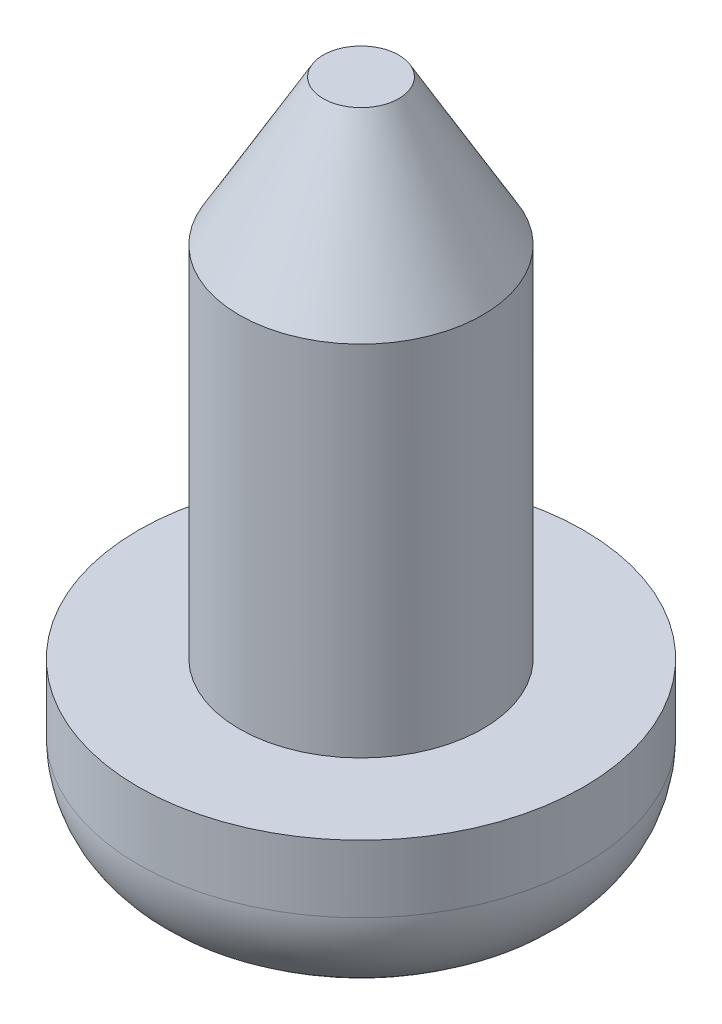
ISO-10303-21;
HEADER;
FILE_DESCRIPTION(('STEP AP214'),'2;1');
FILE_NAME('part.step','',(''),(''),'','','');
FILE_SCHEMA(('AUTOMOTIVE_DESIGN { 1 0 10303 214 1 1 1 1 }'));
ENDSEC;
DATA;
#1=APPLICATION_CONTEXT('core data for automotive mechanical design processes');
#2=APPLICATION_PROTOCOL_DEFINITION('international standard','automotive_design',2000,#1);
#3=PRODUCT_CONTEXT('',#1,'mechanical');
#4=PRODUCT('Part','Part','',(#3));
#5=PRODUCT_RELATED_PRODUCT_CATEGORY('part','',(#4));
#6=PRODUCT_DEFINITION_FORMATION('','',#4);
#7=PRODUCT_DEFINITION_CONTEXT('part definition',#1,'design');
#8=PRODUCT_DEFINITION('design','',#6,#7);
#9=PRODUCT_DEFINITION_SHAPE('','',#8);
#10=(LENGTH_UNIT() NAMED_UNIT(*) SI_UNIT(.MILLI.,.METRE.));
#11=(NAMED_UNIT(*) PLANE_ANGLE_UNIT() SI_UNIT($,.RADIAN.));
#12=(NAMED_UNIT(*) SI_UNIT($,.STERADIAN.) SOLID_ANGLE_UNIT());
#13=UNCERTAINTY_MEASURE_WITH_UNIT(LENGTH_MEASURE(1.E-05),#10,'distance_accuracy_value','');
#14=(GEOMETRIC_REPRESENTATION_CONTEXT(3) GLOBAL_UNCERTAINTY_ASSIGNED_CONTEXT((#13)) GLOBAL_UNIT_ASSIGNED_CONTEXT((#10,
#11,#12)) REPRESENTATION_CONTEXT('',''));
#15=CARTESIAN_POINT('',(0.,0.,0.));
#16=DIRECTION('',(0.,0.,1.));
#17=DIRECTION('',(1.,0.,0.));
#18=AXIS2_PLACEMENT_3D('',#15,#16,#17);
#19=CARTESIAN_POINT('',(-25.6015195369028,-127.705426917511,4.8000000000009));
#20=DIRECTION('',(-0.707106781186548,0.,0.707106781186548));
#21=DIRECTION('',(0.707106781186548,0.,0.707106781186548));
#22=AXIS2_PLACEMENT_3D('',#19,#20,#21);
#23=PLANE('',#22);
#24=DIRECTION('',(0.,-1.,0.));
#25=VECTOR('',#24,1.);
#26=CARTESIAN_POINT('',(-26.0015195369029,-127.705426917511,4.40000000000083));
#27=LINE('',#26,#25);
#28=CARTESIAN_POINT('',(-26.0015195369028,-128.705426917511,4.40000000000081));
#29=VERTEX_POINT('',#28);
#30=CARTESIAN_POINT('',(-26.001519536903,-127.705426917511,4.40000000000071));
#31=VERTEX_POINT('',#30);
#32=EDGE_CURVE('E557',#29,#31,#27,.F.);
#33=ORIENTED_EDGE('',*,*,#32,.T.);
#34=DIRECTION('',(0.707106781186486,0.,0.707106781186609));
#35=VECTOR('',#34,1.);
#36=CARTESIAN_POINT('',(-26.0015195369028,-127.705426917511,4.40000000000083));
#37=LINE('',#36,#35);
#38=CARTESIAN_POINT('',(-25.6015195369027,-127.705426917511,4.8000000000009));
#39=VERTEX_POINT('',#38);
#40=EDGE_CURVE('E555',#31,#39,#37,.T.);
#41=ORIENTED_EDGE('',*,*,#40,.T.);
#42=DIRECTION('',(0.,1.,0.));
#43=VECTOR('',#42,1.);
#44=CARTESIAN_POINT('',(-25.6015195369026,-127.705426917511,4.8000000000009));
#45=LINE('',#44,#43);
#46=CARTESIAN_POINT('',(-25.6015195369026,-128.705426917511,4.80000000000093));
#47=VERTEX_POINT('',#46);
#48=EDGE_CURVE('E540',#39,#47,#45,.F.);
#49=ORIENTED_EDGE('',*,*,#48,.T.);
#50=DIRECTION('',(0.707106781186478,0.,0.707106781186617));
#51=VECTOR('',#50,1.);
#52=CARTESIAN_POINT('',(-26.0015195369029,-128.705426917511,4.40000000000072));
#53=LINE('',#52,#51);
#54=EDGE_CURVE('E547',#29,#47,#53,.T.);
#55=ORIENTED_EDGE('',*,*,#54,.F.);
#56=EDGE_LOOP('',(#33,#41,#49,#55));
#57=FACE_BOUND('',#56,.T.);
#58=ADVANCED_FACE('F17',(#57),#23,.F.);
#59=CARTESIAN_POINT('',(-24.8015195369028,-127.705426917511,4.8000000000009));
#60=DIRECTION('',(0.707106781186548,0.,0.707106781186547));
#61=DIRECTION('',(0.707106781186547,0.,-0.707106781186548));
#62=AXIS2_PLACEMENT_3D('',#59,#60,#61);
#63=PLANE('',#62);
#64=DIRECTION('',(0.,1.,0.));
#65=VECTOR('',#64,1.);
#66=CARTESIAN_POINT('',(-24.8015195369029,-127.705426917511,4.80000000000062));
#67=LINE('',#66,#65);
#68=CARTESIAN_POINT('',(-24.8015195369029,-128.705426917511,4.80000000000055));
#69=VERTEX_POINT('',#68);
#70=CARTESIAN_POINT('',(-24.8015195369029,-127.705426917511,4.80000000000075));
#71=VERTEX_POINT('',#70);
#72=EDGE_CURVE('E140',#69,#71,#67,.T.);
#73=ORIENTED_EDGE('',*,*,#72,.T.);
#74=DIRECTION('',(0.707106781186509,0.,-0.707106781186586));
#75=VECTOR('',#74,1.);
#76=CARTESIAN_POINT('',(-24.8015195369028,-127.705426917511,4.8000000000009));
#77=LINE('',#76,#75);
#78=CARTESIAN_POINT('',(-24.4015195369028,-127.705426917511,4.40000000000086));
#79=VERTEX_POINT('',#78);
#80=EDGE_CURVE('E133',#71,#79,#77,.T.);
#81=ORIENTED_EDGE('',*,*,#80,.T.);
#82=DIRECTION('',(0.,-1.,0.));
#83=VECTOR('',#82,1.);
#84=CARTESIAN_POINT('',(-24.4015195369028,-127.705426917511,4.40000000000086));
#85=LINE('',#84,#83);
#86=CARTESIAN_POINT('',(-24.4015195369028,-128.705426917511,4.40000000000082));
#87=VERTEX_POINT('',#86);
#88=EDGE_CURVE('E476',#79,#87,#85,.T.);
#89=ORIENTED_EDGE('',*,*,#88,.T.);
#90=DIRECTION('',(0.707106781186726,0.,-0.707106781186369));
#91=VECTOR('',#90,1.);
#92=CARTESIAN_POINT('',(-24.801519536903,-128.705426917511,4.80000000000062));
#93=LINE('',#92,#91);
#94=EDGE_CURVE('E642',#69,#87,#93,.T.);
#95=ORIENTED_EDGE('',*,*,#94,.F.);
#96=EDGE_LOOP('',(#73,#81,#89,#95));
#97=FACE_BOUND('',#96,.T.);
#98=ADVANCED_FACE('F239',(#97),#63,.F.);
#99=CARTESIAN_POINT('',(-24.8015195369029,-127.705426917511,3.20000000000102));
#100=DIRECTION('',(0.707106781186548,0.,-0.707106781186548));
#101=DIRECTION('',(-0.707106781186548,0.,-0.707106781186548));
#102=AXIS2_PLACEMENT_3D('',#99,#100,#101);
#103=PLANE('',#102);
#104=DIRECTION('',(0.,1.,0.));
#105=VECTOR('',#104,1.);
#106=CARTESIAN_POINT('',(-24.4015195369028,-127.705426917511,3.60000000000083));
#107=LINE('',#106,#105);
#108=CARTESIAN_POINT('',(-24.4015195369028,-128.705426917511,3.60000000000085));
#109=VERTEX_POINT('',#108);
#110=CARTESIAN_POINT('',(-24.4015195369028,-127.705426917511,3.6000000000008));
#111=VERTEX_POINT('',#110);
#112=EDGE_CURVE('E628',#109,#111,#107,.T.);
#113=ORIENTED_EDGE('',*,*,#112,.T.);
#114=DIRECTION('',(-0.707106781186805,0.,-0.70710678118629));
#115=VECTOR('',#114,1.);
#116=CARTESIAN_POINT('',(-24.4015195369028,-127.705426917511,3.60000000000083));
#117=LINE('',#116,#115);
#118=CARTESIAN_POINT('',(-24.8015195369029,-127.705426917511,3.20000000000102));
#119=VERTEX_POINT('',#118);
#120=EDGE_CURVE('E598',#111,#119,#117,.T.);
#121=ORIENTED_EDGE('',*,*,#120,.T.);
#122=DIRECTION('',(0.,1.,0.));
#123=VECTOR('',#122,1.);
#124=CARTESIAN_POINT('',(-24.8015195369029,-127.705426917511,3.20000000000102));
#125=LINE('',#124,#123);
#126=CARTESIAN_POINT('',(-24.8015195369028,-128.705426917511,3.20000000000096));
#127=VERTEX_POINT('',#126);
#128=EDGE_CURVE('E392',#119,#127,#125,.F.);
#129=ORIENTED_EDGE('',*,*,#128,.T.);
#130=DIRECTION('',(-0.707106781186505,0.,-0.70710678118659));
#131=VECTOR('',#130,1.);
#132=CARTESIAN_POINT('',(-24.4015195369028,-128.705426917511,3.60000000000083));
#133=LINE('',#132,#131);
#134=EDGE_CURVE('E412',#109,#127,#133,.T.);
#135=ORIENTED_EDGE('',*,*,#134,.F.);
#136=EDGE_LOOP('',(#113,#121,#129,#135));
#137=FACE_BOUND('',#136,.T.);
#138=ADVANCED_FACE('F236',(#137),#103,.F.);
#139=CARTESIAN_POINT('',(-25.6015195369029,-127.705426917511,3.20000000000054));
#140=DIRECTION('',(-0.707106781186548,0.,-0.707106781186547));
#141=DIRECTION('',(-0.707106781186547,0.,0.707106781186548));
#142=AXIS2_PLACEMENT_3D('',#139,#140,#141);
#143=PLANE('',#142);
#144=DIRECTION('',(0.,1.,0.));
#145=VECTOR('',#144,1.);
#146=CARTESIAN_POINT('',(-25.601519536903,-127.705426917511,3.20000000000054));
#147=LINE('',#146,#145);
#148=CARTESIAN_POINT('',(-25.601519536903,-128.705426917511,3.20000000000061));
#149=VERTEX_POINT('',#148);
#150=CARTESIAN_POINT('',(-25.601519536903,-127.705426917511,3.20000000000057));
#151=VERTEX_POINT('',#150);
#152=EDGE_CURVE('E601',#149,#151,#147,.T.);
#153=ORIENTED_EDGE('',*,*,#152,.T.);
#154=DIRECTION('',(-0.707106781186344,0.,0.707106781186751));
#155=VECTOR('',#154,1.);
#156=CARTESIAN_POINT('',(-25.6015195369029,-127.705426917511,3.20000000000054));
#157=LINE('',#156,#155);
#158=CARTESIAN_POINT('',(-26.0015195369028,-127.705426917511,3.60000000000067));
#159=VERTEX_POINT('',#158);
#160=EDGE_CURVE('E558',#151,#159,#157,.T.);
#161=ORIENTED_EDGE('',*,*,#160,.T.);
#162=DIRECTION('',(0.,1.,0.));
#163=VECTOR('',#162,1.);
#164=CARTESIAN_POINT('',(-26.0015195369028,-127.705426917511,3.60000000000067));
#165=LINE('',#164,#163);
#166=CARTESIAN_POINT('',(-26.0015195369028,-128.705426917511,3.60000000000067));
#167=VERTEX_POINT('',#166);
#168=EDGE_CURVE('E593',#159,#167,#165,.F.);
#169=ORIENTED_EDGE('',*,*,#168,.T.);
#170=DIRECTION('',(-0.707106781186344,0.,0.707106781186751));
#171=VECTOR('',#170,1.);
#172=CARTESIAN_POINT('',(-25.6015195369029,-128.705426917511,3.20000000000054));
#173=LINE('',#172,#171);
#174=EDGE_CURVE('E329',#149,#167,#173,.T.);
#175=ORIENTED_EDGE('',*,*,#174,.F.);
#176=EDGE_LOOP('',(#153,#161,#169,#175));
#177=FACE_BOUND('',#176,.T.);
#178=ADVANCED_FACE('F233',(#177),#143,.F.);
#179=CARTESIAN_POINT('',(-25.6015195369028,-127.705426917511,4.40000000000083));
#180=DIRECTION('',(0.,1.,0.));
#181=DIRECTION('',(0.,0.,1.));
#182=AXIS2_PLACEMENT_3D('',#179,#180,#181);
#183=PLANE('',#182);
#184=ORIENTED_EDGE('',*,*,#40,.F.);
#185=DIRECTION('',(1.,0.,0.));
#186=VECTOR('',#185,1.);
#187=CARTESIAN_POINT('',(-26.0015195369028,-127.705426917511,4.40000000000083));
#188=LINE('',#187,#186);
#189=CARTESIAN_POINT('',(-26.701519536903,-127.705426917511,4.40000000000085));
#190=VERTEX_POINT('',#189);
#191=EDGE_CURVE('E562',#31,#190,#188,.F.);
#192=ORIENTED_EDGE('',*,*,#191,.T.);
#193=DIRECTION('',(0.,0.,1.));
#194=VECTOR('',#193,1.);
#195=CARTESIAN_POINT('',(-26.701519536903,-127.705426917511,4.40000000000047));
#196=LINE('',#195,#194);
#197=CARTESIAN_POINT('',(-26.701519536903,-127.705426917511,3.6000000000008));
#198=VERTEX_POINT('',#197);
#199=EDGE_CURVE('E173',#190,#198,#196,.F.);
#200=ORIENTED_EDGE('',*,*,#199,.T.);
#201=DIRECTION('',(-1.,0.,0.));
#202=VECTOR('',#201,1.);
#203=CARTESIAN_POINT('',(-26.0015195369028,-127.705426917511,3.60000000000067));
#204=LINE('',#203,#202);
#205=EDGE_CURVE('E216',#198,#159,#204,.F.);
#206=ORIENTED_EDGE('',*,*,#205,.T.);
#207=ORIENTED_EDGE('',*,*,#160,.F.);
#208=DIRECTION('',(0.,0.,1.));
#209=VECTOR('',#208,1.);
#210=CARTESIAN_POINT('',(-25.601519536903,-127.705426917511,2.50000000000068));
#211=LINE('',#210,#209);
#212=CARTESIAN_POINT('',(-25.601519536903,-127.705426917511,2.50000000000073));
#213=VERTEX_POINT('',#212);
#214=EDGE_CURVE('E603',#151,#213,#211,.F.);
#215=ORIENTED_EDGE('',*,*,#214,.T.);
#216=DIRECTION('',(-1.,0.,0.));
#217=VECTOR('',#216,1.);
#218=CARTESIAN_POINT('',(-24.8015195369029,-127.705426917511,2.50000000000082));
#219=LINE('',#218,#217);
#220=CARTESIAN_POINT('',(-24.8015195369029,-127.705426917511,2.50000000000082));
#221=VERTEX_POINT('',#220);
#222=EDGE_CURVE('E391',#213,#221,#219,.F.);
#223=ORIENTED_EDGE('',*,*,#222,.T.);
#224=DIRECTION('',(0.,0.,-1.));
#225=VECTOR('',#224,1.);
#226=CARTESIAN_POINT('',(-24.8015195369029,-127.705426917511,2.50000000000082));
#227=LINE('',#226,#225);
#228=EDGE_CURVE('E613',#221,#119,#227,.F.);
#229=ORIENTED_EDGE('',*,*,#228,.T.);
#230=ORIENTED_EDGE('',*,*,#120,.F.);
#231=DIRECTION('',(-1.,0.,0.));
#232=VECTOR('',#231,1.);
#233=CARTESIAN_POINT('',(-24.4015195369028,-127.705426917511,3.60000000000083));
#234=LINE('',#233,#232);
#235=CARTESIAN_POINT('',(-23.7015195369029,-127.705426917511,3.60000000000083));
#236=VERTEX_POINT('',#235);
#237=EDGE_CURVE('E630',#111,#236,#234,.F.);
#238=ORIENTED_EDGE('',*,*,#237,.T.);
#239=DIRECTION('',(0.,0.,1.));
#240=VECTOR('',#239,1.);
#241=CARTESIAN_POINT('',(-23.7015195369029,-127.705426917511,4.40000000000066));
#242=LINE('',#241,#240);
#243=CARTESIAN_POINT('',(-23.7015195369029,-127.705426917511,4.40000000000073));
#244=VERTEX_POINT('',#243);
#245=EDGE_CURVE('E475',#236,#244,#242,.T.);
#246=ORIENTED_EDGE('',*,*,#245,.T.);
#247=DIRECTION('',(1.,0.,0.));
#248=VECTOR('',#247,1.);
#249=CARTESIAN_POINT('',(-24.4015195369028,-127.705426917511,4.40000000000086));
#250=LINE('',#249,#248);
#251=EDGE_CURVE('E640',#244,#79,#250,.F.);
#252=ORIENTED_EDGE('',*,*,#251,.T.);
#253=ORIENTED_EDGE('',*,*,#80,.F.);
#254=DIRECTION('',(0.,0.,-1.));
#255=VECTOR('',#254,1.);
#256=CARTESIAN_POINT('',(-24.8015195369029,-127.705426917511,5.5000000000009));
#257=LINE('',#256,#255);
#258=CARTESIAN_POINT('',(-24.8015195369029,-127.705426917511,5.5000000000009));
#259=VERTEX_POINT('',#258);
#260=EDGE_CURVE('E516',#71,#259,#257,.F.);
#261=ORIENTED_EDGE('',*,*,#260,.T.);
#262=DIRECTION('',(1.,0.,0.));
#263=VECTOR('',#262,1.);
#264=CARTESIAN_POINT('',(-24.8015195369029,-127.705426917511,5.5000000000009));
#265=LINE('',#264,#263);
#266=CARTESIAN_POINT('',(-25.6015195369026,-127.705426917511,5.5000000000009));
#267=VERTEX_POINT('',#266);
#268=EDGE_CURVE('E520',#259,#267,#265,.F.);
#269=ORIENTED_EDGE('',*,*,#268,.T.);
#270=DIRECTION('',(0.,0.,1.));
#271=VECTOR('',#270,1.);
#272=CARTESIAN_POINT('',(-25.6015195369026,-127.705426917511,5.50000000000099));
#273=LINE('',#272,#271);
#274=EDGE_CURVE('E543',#267,#39,#273,.F.);
#275=ORIENTED_EDGE('',*,*,#274,.T.);
#276=EDGE_LOOP('',(#184,#192,#200,#206,#207,#215,#223,#229,#230,#238,#246,#252,#253,#261,#269,#275));
#277=FACE_BOUND('',#276,.T.);
#278=ADVANCED_FACE('F228',(#277),#183,.F.);
#279=CARTESIAN_POINT('',(-26.0015195369028,-127.705426917511,4.40000000000083));
#280=DIRECTION('',(0.,0.,1.));
#281=DIRECTION('',(0.,-1.,0.));
#282=AXIS2_PLACEMENT_3D('',#279,#280,#281);
#283=PLANE('',#282);
#284=DIRECTION('',(0.,1.,0.));
#285=VECTOR('',#284,1.);
#286=CARTESIAN_POINT('',(-26.701519536903,-127.705426917511,4.40000000000086));
#287=LINE('',#286,#285);
#288=CARTESIAN_POINT('',(-26.701519536903,-128.701048371783,4.40000000000085));
#289=VERTEX_POINT('',#288);
#290=EDGE_CURVE('E190',#289,#190,#287,.T.);
#291=ORIENTED_EDGE('',*,*,#290,.T.);
#292=ORIENTED_EDGE('',*,*,#191,.F.);
#293=ORIENTED_EDGE('',*,*,#32,.F.);
#294=DIRECTION('',(1.,0.,0.));
#295=VECTOR('',#294,1.);
#296=CARTESIAN_POINT('',(-25.2015195369029,-128.705426917511,4.4000000000008));
#297=LINE('',#296,#295);
#298=CARTESIAN_POINT('',(-26.5952555233796,-128.705426917511,4.40000000000081));
#299=VERTEX_POINT('',#298);
#300=EDGE_CURVE('E198',#299,#29,#297,.T.);
#301=ORIENTED_EDGE('',*,*,#300,.F.);
#302=CARTESIAN_POINT('',(-26.7015195369029,-128.701048371783,4.40000000000083));
#303=CARTESIAN_POINT('',(-26.6486181802466,-128.705426917511,4.40000000000083));
#304=CARTESIAN_POINT('',(-26.5952555233796,-128.705426917511,4.40000000000083));
#305=B_SPLINE_CURVE_WITH_KNOTS('',2,(#302,#303,#304),.UNSPECIFIED.,.F.,.F.,(3,3),(0.,1.),.UNSPECIFIED.);
#306=EDGE_CURVE('E183',#289,#299,#305,.T.);
#307=ORIENTED_EDGE('',*,*,#306,.F.);
#308=EDGE_LOOP('',(#291,#292,#293,#301,#307));
#309=FACE_BOUND('',#308,.T.);
#310=ADVANCED_FACE('F196',(#309),#283,.F.);
#311=CARTESIAN_POINT('',(-25.2015195369029,-128.705426917511,4.00000000000076));
#312=DIRECTION('',(0.,-1.,0.));
#313=DIRECTION('',(0.,0.,-1.));
#314=AXIS2_PLACEMENT_3D('',#311,#312,#313);
#315=PLANE('',#314);
#316=ORIENTED_EDGE('',*,*,#300,.T.);
#317=ORIENTED_EDGE('',*,*,#54,.T.);
#318=DIRECTION('',(0.,0.,1.));
#319=VECTOR('',#318,1.);
#320=CARTESIAN_POINT('',(-25.6015195369026,-128.705426917511,5.50000000000099));
#321=LINE('',#320,#319);
#322=CARTESIAN_POINT('',(-25.6015195369028,-128.705426917511,5.39373598647745));
#323=VERTEX_POINT('',#322);
#324=EDGE_CURVE('E80',#47,#323,#321,.T.);
#325=ORIENTED_EDGE('',*,*,#324,.T.);
#326=CARTESIAN_POINT('',(-25.2015195369029,-128.705426917511,4.00000000000076));
#327=DIRECTION('',(0.,1.,0.));
#328=DIRECTION('',(-0.961197232052848,0.,0.275862068965531));
#329=AXIS2_PLACEMENT_3D('',#326,#327,#328);
#330=CIRCLE('',#329,1.45000000000007);
#331=EDGE_CURVE('E199',#299,#323,#330,.T.);
#332=ORIENTED_EDGE('',*,*,#331,.F.);
#333=EDGE_LOOP('',(#316,#317,#325,#332));
#334=FACE_BOUND('',#333,.T.);
#335=ADVANCED_FACE('F227',(#334),#315,.T.);
#336=CARTESIAN_POINT('',(-25.6015195369026,-127.705426917511,5.50000000000099));
#337=DIRECTION('',(-1.,0.,0.));
#338=DIRECTION('',(0.,0.,1.));
#339=AXIS2_PLACEMENT_3D('',#336,#337,#338);
#340=PLANE('',#339);
#341=ORIENTED_EDGE('',*,*,#324,.F.);
#342=ORIENTED_EDGE('',*,*,#48,.F.);
#343=ORIENTED_EDGE('',*,*,#274,.F.);
#344=DIRECTION('',(0.,-1.,0.));
#345=VECTOR('',#344,1.);
#346=CARTESIAN_POINT('',(-25.6015195369026,-127.705426917511,5.5000000000009));
#347=LINE('',#346,#345);
#348=CARTESIAN_POINT('',(-25.6015195369026,-128.701048371783,5.5000000000009));
#349=VERTEX_POINT('',#348);
#350=EDGE_CURVE('E71',#267,#349,#347,.T.);
#351=ORIENTED_EDGE('',*,*,#350,.T.);
#352=CARTESIAN_POINT('',(-25.6015195369026,-128.705426917511,5.39373598647745));
#353=CARTESIAN_POINT('',(-25.6015195369026,-128.705426917511,5.4470986433398));
#354=CARTESIAN_POINT('',(-25.6015195369026,-128.701048371783,5.50000000000099));
#355=B_SPLINE_CURVE_WITH_KNOTS('',2,(#352,#353,#354),.UNSPECIFIED.,.F.,.F.,(3,3),(0.,1.),.UNSPECIFIED.);
#356=EDGE_CURVE('E201',#323,#349,#355,.T.);
#357=ORIENTED_EDGE('',*,*,#356,.F.);
#358=EDGE_LOOP('',(#341,#342,#343,#351,#357));
#359=FACE_BOUND('',#358,.T.);
#360=ADVANCED_FACE('F526',(#359),#340,.F.);
#361=CARTESIAN_POINT('',(-24.8015195369029,-127.705426917511,5.5000000000009));
#362=DIRECTION('',(0.,0.,1.));
#363=DIRECTION('',(0.,-1.,0.));
#364=AXIS2_PLACEMENT_3D('',#361,#362,#363);
#365=PLANE('',#364);
#366=ORIENTED_EDGE('',*,*,#350,.F.);
#367=ORIENTED_EDGE('',*,*,#268,.F.);
#368=DIRECTION('',(0.,1.,0.));
#369=VECTOR('',#368,1.);
#370=CARTESIAN_POINT('',(-24.8015195369029,-127.705426917511,5.5000000000009));
#371=LINE('',#370,#369);
#372=CARTESIAN_POINT('',(-24.8015195369029,-128.701048371783,5.50000000000096));
#373=VERTEX_POINT('',#372);
#374=EDGE_CURVE('E509',#259,#373,#371,.F.);
#375=ORIENTED_EDGE('',*,*,#374,.T.);
#376=CARTESIAN_POINT('',(-25.6015195369026,-128.701048371783,5.5000000000009));
#377=CARTESIAN_POINT('',(-25.5681902608363,-128.701780812457,5.5000000000009));
#378=CARTESIAN_POINT('',(-25.5348580466462,-128.702341137003,5.5000000000009));
#379=CARTESIAN_POINT('',(-25.4681911217274,-128.703212528076,5.5000000000009));
#380=CARTESIAN_POINT('',(-25.4348564110878,-128.70352360118,5.5000000000009));
#381=CARTESIAN_POINT('',(-25.3348551887602,-128.704225408128,5.5000000000009));
#382=CARTESIAN_POINT('',(-25.2681873628315,-128.704384798339,5.5000000000009));
#383=CARTESIAN_POINT('',(-25.134851710974,-128.704384798339,5.5000000000009));
#384=CARTESIAN_POINT('',(-25.0681838850453,-128.704225408128,5.5000000000009));
#385=CARTESIAN_POINT('',(-24.9681826627177,-128.70352360118,5.5000000000009));
#386=CARTESIAN_POINT('',(-24.9348479520781,-128.703212528076,5.5000000000009));
#387=CARTESIAN_POINT('',(-24.8681810271593,-128.702341137003,5.5000000000009));
#388=CARTESIAN_POINT('',(-24.8348488129691,-128.701780812457,5.5000000000009));
#389=CARTESIAN_POINT('',(-24.8015195369029,-128.701048371783,5.5000000000009));
#390=B_SPLINE_CURVE_WITH_KNOTS('',3,(#376,#377,#378,#379,#380,#381,#382,#383,#384,#385,#386,
#387,#388,#389),.UNSPECIFIED.,.F.,.F.,(4,2,2,2,2,2,4),(0.,0.100010330135586,0.20001802085428,
0.400020729846193,0.600023438838106,0.7000311295568,0.800041459692386),.UNSPECIFIED.);
#391=EDGE_CURVE('E675',#349,#373,#390,.T.);
#392=ORIENTED_EDGE('',*,*,#391,.F.);
#393=EDGE_LOOP('',(#366,#367,#375,#392));
#394=FACE_BOUND('',#393,.T.);
#395=ADVANCED_FACE('F503',(#394),#365,.F.);
#396=CARTESIAN_POINT('',(-24.8015195369029,-127.705426917511,5.5000000000009));
#397=DIRECTION('',(1.,0.,0.));
#398=DIRECTION('',(0.,0.,-1.));
#399=AXIS2_PLACEMENT_3D('',#396,#397,#398);
#400=PLANE('',#399);
#401=ORIENTED_EDGE('',*,*,#374,.F.);
#402=ORIENTED_EDGE('',*,*,#260,.F.);
#403=ORIENTED_EDGE('',*,*,#72,.F.);
#404=DIRECTION('',(0.,0.,-1.));
#405=VECTOR('',#404,1.);
#406=CARTESIAN_POINT('',(-24.8015195369029,-128.705426917511,4.00000000000076));
#407=LINE('',#406,#405);
#408=CARTESIAN_POINT('',(-24.8015195369029,-128.705426917511,5.39373598647723));
#409=VERTEX_POINT('',#408);
#410=EDGE_CURVE('E488',#409,#69,#407,.T.);
#411=ORIENTED_EDGE('',*,*,#410,.F.);
#412=CARTESIAN_POINT('',(-24.8015195369029,-128.701048371783,5.50000000000096));
#413=CARTESIAN_POINT('',(-24.8015195369029,-128.705426917511,5.44709864334455));
#414=CARTESIAN_POINT('',(-24.8015195369029,-128.705426917511,5.39373598647723));
#415=B_SPLINE_CURVE_WITH_KNOTS('',2,(#412,#413,#414),.UNSPECIFIED.,.F.,.F.,(3,3),(0.,1.),.UNSPECIFIED.);
#416=EDGE_CURVE('E460',#373,#409,#415,.T.);
#417=ORIENTED_EDGE('',*,*,#416,.F.);
#418=EDGE_LOOP('',(#401,#402,#403,#411,#417));
#419=FACE_BOUND('',#418,.T.);
#420=ADVANCED_FACE('F499',(#419),#400,.F.);
#421=CARTESIAN_POINT('',(-25.2015195369029,-128.705426917511,4.00000000000076));
#422=DIRECTION('',(0.,-1.,0.));
#423=DIRECTION('',(0.,0.,-1.));
#424=AXIS2_PLACEMENT_3D('',#421,#422,#423);
#425=PLANE('',#424);
#426=DIRECTION('',(1.,0.,0.));
#427=VECTOR('',#426,1.);
#428=CARTESIAN_POINT('',(-24.4015195369028,-128.705426917511,4.40000000000086));
#429=LINE('',#428,#427);
#430=CARTESIAN_POINT('',(-23.8077835504262,-128.705426917511,4.40000000000078));
#431=VERTEX_POINT('',#430);
#432=EDGE_CURVE('E468',#87,#431,#429,.T.);
#433=ORIENTED_EDGE('',*,*,#432,.T.);
#434=CARTESIAN_POINT('',(-25.2015195369029,-128.705426917511,4.00000000000076));
#435=DIRECTION('',(0.,1.,0.));
#436=DIRECTION('',(0.275862068965546,0.,0.961197232052844));
#437=AXIS2_PLACEMENT_3D('',#434,#435,#436);
#438=CIRCLE('',#437,1.44999999999984);
#439=EDGE_CURVE('E459',#409,#431,#438,.T.);
#440=ORIENTED_EDGE('',*,*,#439,.F.);
#441=ORIENTED_EDGE('',*,*,#410,.T.);
#442=ORIENTED_EDGE('',*,*,#94,.T.);
#443=EDGE_LOOP('',(#433,#440,#441,#442));
#444=FACE_BOUND('',#443,.T.);
#445=ADVANCED_FACE('F490',(#444),#425,.T.);
#446=CARTESIAN_POINT('',(-24.4015195369028,-127.705426917511,4.40000000000086));
#447=DIRECTION('',(0.,0.,1.));
#448=DIRECTION('',(0.,-1.,0.));
#449=AXIS2_PLACEMENT_3D('',#446,#447,#448);
#450=PLANE('',#449);
#451=ORIENTED_EDGE('',*,*,#432,.F.);
#452=ORIENTED_EDGE('',*,*,#88,.F.);
#453=ORIENTED_EDGE('',*,*,#251,.F.);
#454=DIRECTION('',(0.,1.,0.));
#455=VECTOR('',#454,1.);
#456=CARTESIAN_POINT('',(-23.7015195369029,-127.705426917511,4.40000000000066));
#457=LINE('',#456,#455);
#458=CARTESIAN_POINT('',(-23.7015195369029,-128.701048371783,4.40000000000068));
#459=VERTEX_POINT('',#458);
#460=EDGE_CURVE('E631',#244,#459,#457,.F.);
#461=ORIENTED_EDGE('',*,*,#460,.T.);
#462=CARTESIAN_POINT('',(-23.8077835504262,-128.705426917511,4.40000000000086));
#463=CARTESIAN_POINT('',(-23.7544208935639,-128.705426917511,4.40000000000086));
#464=CARTESIAN_POINT('',(-23.7015195369029,-128.701048371783,4.40000000000086));
#465=B_SPLINE_CURVE_WITH_KNOTS('',2,(#462,#463,#464),.UNSPECIFIED.,.F.,.F.,(3,3),(0.,1.),.UNSPECIFIED.);
#466=EDGE_CURVE('E455',#431,#459,#465,.T.);
#467=ORIENTED_EDGE('',*,*,#466,.F.);
#468=EDGE_LOOP('',(#451,#452,#453,#461,#467));
#469=FACE_BOUND('',#468,.T.);
#470=ADVANCED_FACE('F443',(#469),#450,.F.);
#471=CARTESIAN_POINT('',(-23.7015195369029,-127.705426917511,4.40000000000066));
#472=DIRECTION('',(1.,0.,0.));
#473=DIRECTION('',(0.,1.,0.));
#474=AXIS2_PLACEMENT_3D('',#471,#472,#473);
#475=PLANE('',#474);
#476=CARTESIAN_POINT('',(-23.7015195369029,-128.701048371783,4.4000000000007));
#477=CARTESIAN_POINT('',(-23.7015195369029,-128.701780812457,4.36667072393444));
#478=CARTESIAN_POINT('',(-23.7015195369029,-128.702341137003,4.33333850974428));
#479=CARTESIAN_POINT('',(-23.7015195369029,-128.703212528076,4.26667158482546));
#480=CARTESIAN_POINT('',(-23.7015195369029,-128.70352360118,4.2333368741859));
#481=CARTESIAN_POINT('',(-23.7015195369029,-128.704225408128,4.13333565185823));
#482=CARTESIAN_POINT('',(-23.7015195369029,-128.704384798339,4.0666678259295));
#483=CARTESIAN_POINT('',(-23.7015195369029,-128.704384798339,3.93333217407203));
#484=CARTESIAN_POINT('',(-23.7015195369029,-128.704225408128,3.86666434814329));
#485=CARTESIAN_POINT('',(-23.7015195369029,-128.70352360118,3.7666631258156));
#486=CARTESIAN_POINT('',(-23.7015195369029,-128.703212528076,3.73332841517604));
#487=CARTESIAN_POINT('',(-23.7015195369029,-128.702341137003,3.66666149025721));
#488=CARTESIAN_POINT('',(-23.7015195369029,-128.701780812457,3.63332927606705));
#489=CARTESIAN_POINT('',(-23.7015195369029,-128.701048371783,3.60000000000078));
#490=B_SPLINE_CURVE_WITH_KNOTS('',3,(#476,#477,#478,#479,#480,#481,#482,#483,#484,#485,#486,
#487,#488,#489),.UNSPECIFIED.,.F.,.F.,(4,2,2,2,2,2,4),(0.,0.100010330135607,0.200018020854321,
0.400020729846275,0.600023438838254,0.70003112955698,0.8000414596926),.UNSPECIFIED.);
#491=CARTESIAN_POINT('',(-23.7015195369029,-128.701048371783,3.60000000000083));
#492=VERTEX_POINT('',#491);
#493=EDGE_CURVE('E448',#459,#492,#490,.T.);
#494=ORIENTED_EDGE('',*,*,#493,.F.);
#495=ORIENTED_EDGE('',*,*,#460,.F.);
#496=ORIENTED_EDGE('',*,*,#245,.F.);
#497=DIRECTION('',(0.,1.,0.));
#498=VECTOR('',#497,1.);
#499=CARTESIAN_POINT('',(-23.7015195369029,-127.705426917511,3.60000000000083));
#500=LINE('',#499,#498);
#501=EDGE_CURVE('E413',#236,#492,#500,.F.);
#502=ORIENTED_EDGE('',*,*,#501,.T.);
#503=EDGE_LOOP('',(#494,#495,#496,#502));
#504=FACE_BOUND('',#503,.T.);
#505=ADVANCED_FACE('F438',(#504),#475,.F.);
#506=CARTESIAN_POINT('',(-24.4015195369028,-127.705426917511,3.60000000000083));
#507=DIRECTION('',(0.,0.,-1.));
#508=DIRECTION('',(-1.,0.,0.));
#509=AXIS2_PLACEMENT_3D('',#506,#507,#508);
#510=PLANE('',#509);
#511=ORIENTED_EDGE('',*,*,#501,.F.);
#512=ORIENTED_EDGE('',*,*,#237,.F.);
#513=ORIENTED_EDGE('',*,*,#112,.F.);
#514=DIRECTION('',(1.,0.,0.));
#515=VECTOR('',#514,1.);
#516=CARTESIAN_POINT('',(-25.2015195369029,-128.705426917511,3.60000000000086));
#517=LINE('',#516,#515);
#518=CARTESIAN_POINT('',(-23.8077835504261,-128.705426917511,3.60000000000085));
#519=VERTEX_POINT('',#518);
#520=EDGE_CURVE('E405',#519,#109,#517,.F.);
#521=ORIENTED_EDGE('',*,*,#520,.F.);
#522=CARTESIAN_POINT('',(-23.7015195369029,-128.701048371783,3.60000000000083));
#523=CARTESIAN_POINT('',(-23.7544208935592,-128.705426917511,3.60000000000083));
#524=CARTESIAN_POINT('',(-23.8077835504261,-128.705426917511,3.60000000000083));
#525=B_SPLINE_CURVE_WITH_KNOTS('',2,(#522,#523,#524),.UNSPECIFIED.,.F.,.F.,(3,3),(0.,1.),.UNSPECIFIED.);
#526=EDGE_CURVE('E454',#492,#519,#525,.T.);
#527=ORIENTED_EDGE('',*,*,#526,.F.);
#528=EDGE_LOOP('',(#511,#512,#513,#521,#527));
#529=FACE_BOUND('',#528,.T.);
#530=ADVANCED_FACE('F429',(#529),#510,.F.);
#531=CARTESIAN_POINT('',(-25.2015195369029,-128.705426917511,4.00000000000076));
#532=DIRECTION('',(0.,-1.,0.));
#533=DIRECTION('',(0.,0.,-1.));
#534=AXIS2_PLACEMENT_3D('',#531,#532,#533);
#535=PLANE('',#534);
#536=DIRECTION('',(0.,0.,-1.));
#537=VECTOR('',#536,1.);
#538=CARTESIAN_POINT('',(-24.8015195369029,-128.705426917511,2.50000000000082));
#539=LINE('',#538,#537);
#540=CARTESIAN_POINT('',(-24.8015195369028,-128.705426917511,2.60626401352427));
#541=VERTEX_POINT('',#540);
#542=EDGE_CURVE('E384',#127,#541,#539,.T.);
#543=ORIENTED_EDGE('',*,*,#542,.T.);
#544=CARTESIAN_POINT('',(-25.2015195369029,-128.705426917511,4.00000000000076));
#545=DIRECTION('',(0.,1.,0.));
#546=DIRECTION('',(0.961197232052878,0.,-0.275862068965426));
#547=AXIS2_PLACEMENT_3D('',#544,#545,#546);
#548=CIRCLE('',#547,1.45000000000013);
#549=EDGE_CURVE('E400',#519,#541,#548,.T.);
#550=ORIENTED_EDGE('',*,*,#549,.F.);
#551=ORIENTED_EDGE('',*,*,#520,.T.);
#552=ORIENTED_EDGE('',*,*,#134,.T.);
#553=EDGE_LOOP('',(#543,#550,#551,#552));
#554=FACE_BOUND('',#553,.T.);
#555=ADVANCED_FACE('F374',(#554),#535,.T.);
#556=CARTESIAN_POINT('',(-24.8015195369029,-127.705426917511,2.50000000000082));
#557=DIRECTION('',(1.,0.,0.));
#558=DIRECTION('',(0.,0.,-1.));
#559=AXIS2_PLACEMENT_3D('',#556,#557,#558);
#560=PLANE('',#559);
#561=ORIENTED_EDGE('',*,*,#542,.F.);
#562=ORIENTED_EDGE('',*,*,#128,.F.);
#563=ORIENTED_EDGE('',*,*,#228,.F.);
#564=DIRECTION('',(0.,1.,0.));
#565=VECTOR('',#564,1.);
#566=CARTESIAN_POINT('',(-24.8015195369029,-127.705426917511,2.50000000000082));
#567=LINE('',#566,#565);
#568=CARTESIAN_POINT('',(-24.8015195369028,-128.701048371783,2.50000000000082));
#569=VERTEX_POINT('',#568);
#570=EDGE_CURVE('E604',#221,#569,#567,.F.);
#571=ORIENTED_EDGE('',*,*,#570,.T.);
#572=CARTESIAN_POINT('',(-24.8015195369029,-128.705426917511,2.60626401352433));
#573=CARTESIAN_POINT('',(-24.8015195369029,-128.705426917511,2.55290135666192));
#574=CARTESIAN_POINT('',(-24.8015195369029,-128.701048371783,2.50000000000076));
#575=B_SPLINE_CURVE_WITH_KNOTS('',2,(#572,#573,#574),.UNSPECIFIED.,.F.,.F.,(3,3),(0.,1.),.UNSPECIFIED.);
#576=EDGE_CURVE('E362',#541,#569,#575,.T.);
#577=ORIENTED_EDGE('',*,*,#576,.F.);
#578=EDGE_LOOP('',(#561,#562,#563,#571,#577));
#579=FACE_BOUND('',#578,.T.);
#580=ADVANCED_FACE('F369',(#579),#560,.F.);
#581=CARTESIAN_POINT('',(-24.8015195369029,-127.705426917511,2.50000000000082));
#582=DIRECTION('',(0.,0.,-1.));
#583=DIRECTION('',(-1.,0.,0.));
#584=AXIS2_PLACEMENT_3D('',#581,#582,#583);
#585=PLANE('',#584);
#586=ORIENTED_EDGE('',*,*,#570,.F.);
#587=ORIENTED_EDGE('',*,*,#222,.F.);
#588=DIRECTION('',(0.,1.,0.));
#589=VECTOR('',#588,1.);
#590=CARTESIAN_POINT('',(-25.601519536903,-127.705426917511,2.50000000000068));
#591=LINE('',#590,#589);
#592=CARTESIAN_POINT('',(-25.601519536903,-128.701048371783,2.50000000000068));
#593=VERTEX_POINT('',#592);
#594=EDGE_CURVE('E330',#213,#593,#591,.F.);
#595=ORIENTED_EDGE('',*,*,#594,.T.);
#596=CARTESIAN_POINT('',(-24.8015195369028,-128.701048371783,2.50000000000082));
#597=CARTESIAN_POINT('',(-24.8348488129691,-128.701780812457,2.50000000000082));
#598=CARTESIAN_POINT('',(-24.8681810271593,-128.702341137003,2.50000000000082));
#599=CARTESIAN_POINT('',(-24.9348479520781,-128.703212528076,2.50000000000082));
#600=CARTESIAN_POINT('',(-24.9681826627177,-128.70352360118,2.50000000000082));
#601=CARTESIAN_POINT('',(-25.0681838850454,-128.704225408128,2.50000000000082));
#602=CARTESIAN_POINT('',(-25.1348517109742,-128.704384798339,2.50000000000082));
#603=CARTESIAN_POINT('',(-25.2681873628317,-128.704384798339,2.50000000000082));
#604=CARTESIAN_POINT('',(-25.3348551887604,-128.704225408128,2.50000000000082));
#605=CARTESIAN_POINT('',(-25.4348564110881,-128.70352360118,2.50000000000082));
#606=CARTESIAN_POINT('',(-25.4681911217277,-128.703212528076,2.50000000000082));
#607=CARTESIAN_POINT('',(-25.5348580466466,-128.702341137003,2.50000000000082));
#608=CARTESIAN_POINT('',(-25.5681902608367,-128.701780812457,2.50000000000082));
#609=CARTESIAN_POINT('',(-25.601519536903,-128.701048371783,2.50000000000082));
#610=B_SPLINE_CURVE_WITH_KNOTS('',3,(#596,#597,#598,#599,#600,#601,#602,#603,#604,#605,#606,
#607,#608,#609),.UNSPECIFIED.,.F.,.F.,(4,2,2,2,2,2,4),(0.,0.100010330135645,0.200018020854398,
0.400020729846429,0.60002343883846,0.700031129557213,0.800041459692862),.UNSPECIFIED.);
#611=EDGE_CURVE('E356',#569,#593,#610,.T.);
#612=ORIENTED_EDGE('',*,*,#611,.F.);
#613=EDGE_LOOP('',(#586,#587,#595,#612));
#614=FACE_BOUND('',#613,.T.);
#615=ADVANCED_FACE('F365',(#614),#585,.F.);
#616=CARTESIAN_POINT('',(-25.601519536903,-127.705426917511,2.50000000000068));
#617=DIRECTION('',(-1.,0.,0.));
#618=DIRECTION('',(0.,0.,1.));
#619=AXIS2_PLACEMENT_3D('',#616,#617,#618);
#620=PLANE('',#619);
#621=ORIENTED_EDGE('',*,*,#594,.F.);
#622=ORIENTED_EDGE('',*,*,#214,.F.);
#623=ORIENTED_EDGE('',*,*,#152,.F.);
#624=DIRECTION('',(0.,0.,-1.));
#625=VECTOR('',#624,1.);
#626=CARTESIAN_POINT('',(-25.601519536903,-128.705426917511,4.00000000000076));
#627=LINE('',#626,#625);
#628=CARTESIAN_POINT('',(-25.601519536903,-128.705426917511,2.60626401352394));
#629=VERTEX_POINT('',#628);
#630=EDGE_CURVE('E321',#629,#149,#627,.F.);
#631=ORIENTED_EDGE('',*,*,#630,.F.);
#632=CARTESIAN_POINT('',(-25.601519536903,-128.701048371783,2.50000000000068));
#633=CARTESIAN_POINT('',(-25.601519536903,-128.705426917511,2.55290135665682));
#634=CARTESIAN_POINT('',(-25.601519536903,-128.705426917511,2.60626401352394));
#635=B_SPLINE_CURVE_WITH_KNOTS('',2,(#632,#633,#634),.UNSPECIFIED.,.F.,.F.,(3,3),(0.,1.),.UNSPECIFIED.);
#636=EDGE_CURVE('E354',#593,#629,#635,.T.);
#637=ORIENTED_EDGE('',*,*,#636,.F.);
#638=EDGE_LOOP('',(#621,#622,#623,#631,#637));
#639=FACE_BOUND('',#638,.T.);
#640=ADVANCED_FACE('F311',(#639),#620,.F.);
#641=CARTESIAN_POINT('',(-25.2015195369029,-128.705426917511,4.00000000000076));
#642=DIRECTION('',(0.,-1.,0.));
#643=DIRECTION('',(0.,0.,-1.));
#644=AXIS2_PLACEMENT_3D('',#641,#642,#643);
#645=PLANE('',#644);
#646=DIRECTION('',(-1.,0.,0.));
#647=VECTOR('',#646,1.);
#648=CARTESIAN_POINT('',(-26.0015195369028,-128.705426917511,3.60000000000067));
#649=LINE('',#648,#647);
#650=CARTESIAN_POINT('',(-26.5952555233795,-128.705426917511,3.60000000000072));
#651=VERTEX_POINT('',#650);
#652=EDGE_CURVE('E194',#167,#651,#649,.T.);
#653=ORIENTED_EDGE('',*,*,#652,.T.);
#654=CARTESIAN_POINT('',(-25.2015195369029,-128.705426917511,4.00000000000076));
#655=DIRECTION('',(0.,1.,0.));
#656=DIRECTION('',(-0.275862068965548,0.,-0.961197232052843));
#657=AXIS2_PLACEMENT_3D('',#654,#655,#656);
#658=CIRCLE('',#657,1.4500000000002);
#659=EDGE_CURVE('E335',#629,#651,#658,.T.);
#660=ORIENTED_EDGE('',*,*,#659,.F.);
#661=ORIENTED_EDGE('',*,*,#630,.T.);
#662=ORIENTED_EDGE('',*,*,#174,.T.);
#663=EDGE_LOOP('',(#653,#660,#661,#662));
#664=FACE_BOUND('',#663,.T.);
#665=ADVANCED_FACE('F306',(#664),#645,.T.);
#666=CARTESIAN_POINT('',(-26.0015195369028,-127.705426917511,3.60000000000067));
#667=DIRECTION('',(0.,0.,-1.));
#668=DIRECTION('',(-1.,0.,0.));
#669=AXIS2_PLACEMENT_3D('',#666,#667,#668);
#670=PLANE('',#669);
#671=ORIENTED_EDGE('',*,*,#652,.F.);
#672=ORIENTED_EDGE('',*,*,#168,.F.);
#673=ORIENTED_EDGE('',*,*,#205,.F.);
#674=DIRECTION('',(0.,1.,0.));
#675=VECTOR('',#674,1.);
#676=CARTESIAN_POINT('',(-26.701519536903,-127.705426917511,3.60000000000086));
#677=LINE('',#676,#675);
#678=CARTESIAN_POINT('',(-26.701519536903,-128.701048371783,3.60000000000089));
#679=VERTEX_POINT('',#678);
#680=EDGE_CURVE('E37',#198,#679,#677,.F.);
#681=ORIENTED_EDGE('',*,*,#680,.T.);
#682=CARTESIAN_POINT('',(-26.5952555233795,-128.705426917511,3.60000000000067));
#683=CARTESIAN_POINT('',(-26.6486181802419,-128.705426917511,3.60000000000067));
#684=CARTESIAN_POINT('',(-26.7015195369029,-128.701048371783,3.60000000000067));
#685=B_SPLINE_CURVE_WITH_KNOTS('',2,(#682,#683,#684),.UNSPECIFIED.,.F.,.F.,(3,3),(0.,1.),.UNSPECIFIED.);
#686=EDGE_CURVE('E185',#651,#679,#685,.T.);
#687=ORIENTED_EDGE('',*,*,#686,.F.);
#688=EDGE_LOOP('',(#671,#672,#673,#681,#687));
#689=FACE_BOUND('',#688,.T.);
#690=ADVANCED_FACE('F297',(#689),#670,.F.);
#691=CARTESIAN_POINT('',(-26.701519536903,-127.705426917511,4.40000000000047));
#692=DIRECTION('',(-1.,0.,0.));
#693=DIRECTION('',(0.,0.,1.));
#694=AXIS2_PLACEMENT_3D('',#691,#692,#693);
#695=PLANE('',#694);
#696=CARTESIAN_POINT('',(-26.701519536903,-128.701048371783,3.60000000000087));
#697=CARTESIAN_POINT('',(-26.701519536903,-128.701780812457,3.63332927606713));
#698=CARTESIAN_POINT('',(-26.701519536903,-128.702341137003,3.66666149025728));
#699=CARTESIAN_POINT('',(-26.701519536903,-128.703212528076,3.7333284151761));
#700=CARTESIAN_POINT('',(-26.701519536903,-128.70352360118,3.76666312581565));
#701=CARTESIAN_POINT('',(-26.701519536903,-128.704225408128,3.86666434814332));
#702=CARTESIAN_POINT('',(-26.701519536903,-128.704384798339,3.93333217407204));
#703=CARTESIAN_POINT('',(-26.701519536903,-128.704384798339,4.06666782592952));
#704=CARTESIAN_POINT('',(-26.701519536903,-128.704225408128,4.13333565185828));
#705=CARTESIAN_POINT('',(-26.701519536903,-128.70352360118,4.23333687418599));
#706=CARTESIAN_POINT('',(-26.701519536903,-128.703212528076,4.26667158482556));
#707=CARTESIAN_POINT('',(-26.701519536903,-128.702341137003,4.33333850974441));
#708=CARTESIAN_POINT('',(-26.701519536903,-128.701780812457,4.36667072393458));
#709=CARTESIAN_POINT('',(-26.701519536903,-128.701048371783,4.40000000000085));
#710=B_SPLINE_CURVE_WITH_KNOTS('',3,(#696,#697,#698,#699,#700,#701,#702,#703,#704,#705,#706,
#707,#708,#709),.UNSPECIFIED.,.F.,.F.,(4,2,2,2,2,2,4),(0.,0.100010330135598,0.200018020854301,
0.400020729846234,0.600023438838267,0.70003112955702,0.800041459692666),.UNSPECIFIED.);
#711=EDGE_CURVE('E178',#679,#289,#710,.T.);
#712=ORIENTED_EDGE('',*,*,#711,.F.);
#713=ORIENTED_EDGE('',*,*,#680,.F.);
#714=ORIENTED_EDGE('',*,*,#199,.F.);
#715=ORIENTED_EDGE('',*,*,#290,.F.);
#716=EDGE_LOOP('',(#712,#713,#714,#715));
#717=FACE_BOUND('',#716,.T.);
#718=ADVANCED_FACE('F191',(#717),#695,.F.);
#719=CARTESIAN_POINT('',(-25.2015195369029,-127.505426917511,4.00000000000076));
#720=DIRECTION('',(0.,-1.,0.));
#721=DIRECTION('',(1.,0.,0.));
#722=AXIS2_PLACEMENT_3D('',#719,#720,#721);
#723=TOROIDAL_SURFACE('',#722,1.45,1.2);
#724=CARTESIAN_POINT('',(-25.2015195369029,-127.505426917511,4.00000000000076));
#725=DIRECTION('',(0.,-1.,0.));
#726=DIRECTION('',(0.,0.,-1.));
#727=AXIS2_PLACEMENT_3D('',#724,#725,#726);
#728=CIRCLE('',#727,2.65000000000001);
#729=CARTESIAN_POINT('',(-25.2015195369029,-127.505426917511,1.35000000000075));
#730=VERTEX_POINT('',#729);
#731=EDGE_CURVE('E187',#730,#730,#728,.F.);
#732=ORIENTED_EDGE('',*,*,#731,.F.);
#733=EDGE_LOOP('',(#732));
#734=FACE_BOUND('',#733,.T.);
#735=ORIENTED_EDGE('',*,*,#686,.T.);
#736=ORIENTED_EDGE('',*,*,#711,.T.);
#737=ORIENTED_EDGE('',*,*,#306,.T.);
#738=ORIENTED_EDGE('',*,*,#331,.T.);
#739=ORIENTED_EDGE('',*,*,#356,.T.);
#740=ORIENTED_EDGE('',*,*,#391,.T.);
#741=ORIENTED_EDGE('',*,*,#416,.T.);
#742=ORIENTED_EDGE('',*,*,#439,.T.);
#743=ORIENTED_EDGE('',*,*,#466,.T.);
#744=ORIENTED_EDGE('',*,*,#493,.T.);
#745=ORIENTED_EDGE('',*,*,#526,.T.);
#746=ORIENTED_EDGE('',*,*,#549,.T.);
#747=ORIENTED_EDGE('',*,*,#576,.T.);
#748=ORIENTED_EDGE('',*,*,#611,.T.);
#749=ORIENTED_EDGE('',*,*,#636,.T.);
#750=ORIENTED_EDGE('',*,*,#659,.T.);
#751=EDGE_LOOP('',(#735,#736,#737,#738,#739,#740,#741,#742,#743,#744,#745,#746,#747,#748,#749,#750));
#752=FACE_BOUND('',#751,.T.);
#753=ADVANCED_FACE('F180',(#734,#752),#723,.T.);
#754=CARTESIAN_POINT('',(-25.2015195369031,-120.705426917511,4.00000000000054));
#755=DIRECTION('',(0.,-1.,0.));
#756=DIRECTION('',(0.,0.,-1.));
#757=AXIS2_PLACEMENT_3D('',#754,#755,#756);
#758=PLANE('',#757);
#759=CARTESIAN_POINT('',(-25.201519536903,-120.705426917539,4.00000000000065));
#760=DIRECTION('',(0.,-1.,0.));
#761=DIRECTION('',(0.,0.,-1.));
#762=AXIS2_PLACEMENT_3D('',#759,#760,#761);
#763=CIRCLE('',#762,0.449999999954237);
#764=CARTESIAN_POINT('',(-25.201519536903,-120.705426917539,3.55000000004642));
#765=VERTEX_POINT('',#764);
#766=EDGE_CURVE('E568',#765,#765,#763,.T.);
#767=ORIENTED_EDGE('',*,*,#766,.F.);
#768=EDGE_LOOP('',(#767));
#769=FACE_BOUND('',#768,.T.);
#770=ADVANCED_FACE('F267',(#769),#758,.F.);
#771=CARTESIAN_POINT('',(-25.2015195369029,-128.705426917511,4.00000000000076));
#772=DIRECTION('',(0.,-1.,0.));
#773=DIRECTION('',(0.,0.,-1.));
#774=AXIS2_PLACEMENT_3D('',#771,#772,#773);
#775=CYLINDRICAL_SURFACE('',#774,2.65000000000001);
#776=ORIENTED_EDGE('',*,*,#731,.T.);
#777=EDGE_LOOP('',(#776));
#778=FACE_BOUND('',#777,.T.);
#779=CARTESIAN_POINT('',(-25.2015195369029,-126.705426917511,4.00000000000076));
#780=DIRECTION('',(0.,-1.,0.));
#781=DIRECTION('',(0.,0.,-1.));
#782=AXIS2_PLACEMENT_3D('',#779,#780,#781);
#783=CIRCLE('',#782,2.65000000000001);
#784=CARTESIAN_POINT('',(-25.2015195369029,-126.705426917511,1.35000000000075));
#785=VERTEX_POINT('',#784);
#786=EDGE_CURVE('E565',#785,#785,#783,.T.);
#787=ORIENTED_EDGE('',*,*,#786,.T.);
#788=EDGE_LOOP('',(#787));
#789=FACE_BOUND('',#788,.T.);
#790=ADVANCED_FACE('F263',(#778,#789),#775,.T.);
#791=CARTESIAN_POINT('',(-25.201519536903,-122.437477725157,4.00000000000065));
#792=DIRECTION('',(0.,-1.,0.));
#793=DIRECTION('',(0.,0.,-1.));
#794=AXIS2_PLACEMENT_3D('',#791,#792,#793);
#795=CONICAL_SURFACE('',#794,1.44999999998743,0.523598775600348);
#796=CARTESIAN_POINT('',(-25.2015195369031,-122.43747772508,4.00000000000054));
#797=DIRECTION('',(0.,1.,0.));
#798=DIRECTION('',(0.,0.,1.));
#799=AXIS2_PLACEMENT_3D('',#796,#797,#798);
#800=CIRCLE('',#799,1.45000000000001);
#801=CARTESIAN_POINT('',(-25.201519536903,-122.43747772508,2.55000000005761));
#802=VERTEX_POINT('',#801);
#803=EDGE_CURVE('E28',#802,#802,#800,.F.);
#804=CARTESIAN_POINT('',(-25.201519536903,-120.705426917539,3.55000000004642));
#805=CARTESIAN_POINT('',(-25.201519536903,-120.723469113451,3.53958333337987));
#806=CARTESIAN_POINT('',(-25.201519536903,-120.741511309362,3.52916666671332));
#807=CARTESIAN_POINT('',(-25.201519536903,-120.777595701186,3.50833333338022));
#808=CARTESIAN_POINT('',(-25.201519536903,-120.795637897098,3.49791666671367));
#809=CARTESIAN_POINT('',(-25.201519536903,-120.831722288922,3.47708333338057));
#810=CARTESIAN_POINT('',(-25.201519536903,-120.849764484834,3.46666666671402));
#811=CARTESIAN_POINT('',(-25.201519536903,-120.885848876658,3.44583333338092));
#812=CARTESIAN_POINT('',(-25.201519536903,-120.903891072569,3.43541666671437));
#813=CARTESIAN_POINT('',(-25.201519536903,-120.939975464393,3.41458333338127));
#814=CARTESIAN_POINT('',(-25.201519536903,-120.958017660305,3.40416666671472));
#815=CARTESIAN_POINT('',(-25.201519536903,-120.994102052129,3.38333333338162));
#816=CARTESIAN_POINT('',(-25.201519536903,-121.012144248041,3.37291666671507));
#817=CARTESIAN_POINT('',(-25.201519536903,-121.048228639865,3.35208333338197));
#818=CARTESIAN_POINT('',(-25.201519536903,-121.066270835776,3.34166666671542));
#819=CARTESIAN_POINT('',(-25.201519536903,-121.1023552276,3.32083333338232));
#820=CARTESIAN_POINT('',(-25.201519536903,-121.120397423512,3.31041666671577));
#821=CARTESIAN_POINT('',(-25.201519536903,-121.156481815336,3.28958333338266));
#822=CARTESIAN_POINT('',(-25.201519536903,-121.174524011248,3.27916666671612));
#823=CARTESIAN_POINT('',(-25.201519536903,-121.210608403072,3.25833333338302));
#824=CARTESIAN_POINT('',(-25.201519536903,-121.228650598983,3.24791666671647));
#825=CARTESIAN_POINT('',(-25.201519536903,-121.264734990807,3.22708333338336));
#826=CARTESIAN_POINT('',(-25.201519536903,-121.282777186719,3.21666666671682));
#827=CARTESIAN_POINT('',(-25.201519536903,-121.318861578543,3.19583333338371));
#828=CARTESIAN_POINT('',(-25.201519536903,-121.336903774455,3.18541666671717));
#829=CARTESIAN_POINT('',(-25.201519536903,-121.372988166279,3.16458333338406));
#830=CARTESIAN_POINT('',(-25.201519536903,-121.39103036219,3.15416666671751));
#831=CARTESIAN_POINT('',(-25.201519536903,-121.427114754014,3.13333333338441));
#832=CARTESIAN_POINT('',(-25.201519536903,-121.445156949926,3.12291666671786));
#833=CARTESIAN_POINT('',(-25.201519536903,-121.48124134175,3.10208333338476));
#834=CARTESIAN_POINT('',(-25.201519536903,-121.499283537662,3.09166666671821));
#835=CARTESIAN_POINT('',(-25.201519536903,-121.535367929486,3.07083333338511));
#836=CARTESIAN_POINT('',(-25.201519536903,-121.553410125397,3.06041666671857));
#837=CARTESIAN_POINT('',(-25.201519536903,-121.589494517221,3.03958333338546));
#838=CARTESIAN_POINT('',(-25.201519536903,-121.607536713133,3.02916666671891));
#839=CARTESIAN_POINT('',(-25.201519536903,-121.643621104957,3.00833333338581));
#840=CARTESIAN_POINT('',(-25.201519536903,-121.661663300869,2.99791666671926));
#841=CARTESIAN_POINT('',(-25.201519536903,-121.697747692693,2.97708333338616));
#842=CARTESIAN_POINT('',(-25.201519536903,-121.715789888604,2.96666666671961));
#843=CARTESIAN_POINT('',(-25.201519536903,-121.751874280428,2.94583333338651));
#844=CARTESIAN_POINT('',(-25.201519536903,-121.76991647634,2.93541666671996));
#845=CARTESIAN_POINT('',(-25.201519536903,-121.806000868164,2.91458333338686));
#846=CARTESIAN_POINT('',(-25.201519536903,-121.824043064076,2.90416666672031));
#847=CARTESIAN_POINT('',(-25.201519536903,-121.8601274559,2.88333333338721));
#848=CARTESIAN_POINT('',(-25.201519536903,-121.878169651811,2.87291666672066));
#849=CARTESIAN_POINT('',(-25.201519536903,-121.914254043635,2.85208333338756));
#850=CARTESIAN_POINT('',(-25.201519536903,-121.932296239547,2.84166666672101));
#851=CARTESIAN_POINT('',(-25.201519536903,-121.968380631371,2.82083333338791));
#852=CARTESIAN_POINT('',(-25.201519536903,-121.986422827283,2.81041666672136));
#853=CARTESIAN_POINT('',(-25.201519536903,-122.022507219107,2.78958333338826));
#854=CARTESIAN_POINT('',(-25.201519536903,-122.040549415018,2.77916666672171));
#855=CARTESIAN_POINT('',(-25.201519536903,-122.076633806842,2.75833333338861));
#856=CARTESIAN_POINT('',(-25.201519536903,-122.094676002754,2.74791666672206));
#857=CARTESIAN_POINT('',(-25.201519536903,-122.130760394578,2.72708333338896));
#858=CARTESIAN_POINT('',(-25.201519536903,-122.14880259049,2.71666666672241));
#859=CARTESIAN_POINT('',(-25.201519536903,-122.184886982314,2.69583333338931));
#860=CARTESIAN_POINT('',(-25.201519536903,-122.202929178225,2.68541666672276));
#861=CARTESIAN_POINT('',(-25.201519536903,-122.239013570049,2.66458333338966));
#862=CARTESIAN_POINT('',(-25.201519536903,-122.257055765961,2.65416666672311));
#863=CARTESIAN_POINT('',(-25.201519536903,-122.293140157785,2.63333333339001));
#864=CARTESIAN_POINT('',(-25.201519536903,-122.311182353697,2.62291666672346));
#865=CARTESIAN_POINT('',(-25.201519536903,-122.347266745521,2.60208333339036));
#866=CARTESIAN_POINT('',(-25.201519536903,-122.365308941432,2.59166666672381));
#867=CARTESIAN_POINT('',(-25.201519536903,-122.401393333256,2.57083333339071));
#868=CARTESIAN_POINT('',(-25.201519536903,-122.419435529168,2.56041666672416));
#869=CARTESIAN_POINT('',(-25.201519536903,-122.43747772508,2.55000000005761));
#870=B_SPLINE_CURVE_WITH_KNOTS('',3,(#804,#805,#806,#807,#808,#809,#810,#811,#812,#813,#814,
#815,#816,#817,#818,#819,#820,#821,#822,#823,#824,#825,#826,#827,#828,#829,#830,#831,#832,#833,
#834,#835,#836,#837,#838,#839,#840,#841,#842,#843,#844,#845,#846,#847,#848,#849,#850,#851,#852,
#853,#854,#855,#856,#857,#858,#859,#860,#861,#862,#863,#864,#865,#866,#867,#868,#869),
.UNSPECIFIED.,.F.,.F.,(4,2,2,2,2,2,2,2,2,2,2,2,2,2,2,2,2,2,2,2,2,2,2,2,2,2,2,2,2,2,2,2,4),(0.,
0.0624999999990683,0.124999999998149,0.187499999997229,0.249999999996309,0.312499999995389,
0.374999999994469,0.43749999999355,0.499999999992618,0.562499999991698,0.624999999990778,
0.687499999989858,0.749999999988939,0.812499999988019,0.874999999987099,0.937499999986179,
0.999999999985259,1.06249999998433,1.12499999998341,1.18749999998249,1.24999999998157,
1.31249999998065,1.37499999997973,1.43749999997881,1.49999999997788,1.56249999997696,
1.62499999997604,1.68749999997512,1.7499999999742,1.81249999997328,1.87499999997236,
1.93749999997144,1.99999999997052),.UNSPECIFIED.);
#871=EDGE_CURVE('BSEAM255',#765,#802,#870,.T.);
#872=ORIENTED_EDGE('',*,*,#766,.T.);
#873=ORIENTED_EDGE('',*,*,#803,.F.);
#874=ORIENTED_EDGE('',*,*,#871,.T.);
#875=ORIENTED_EDGE('',*,*,#871,.F.);
#876=EDGE_LOOP('',(#872,#874,#873,#875));
#877=FACE_BOUND('',#876,.T.);
#878=ADVANCED_FACE('F255',(#877),#795,.T.);
#879=CARTESIAN_POINT('',(-25.2015195369029,-126.705426917511,4.00000000000071));
#880=DIRECTION('',(0.,-1.,0.));
#881=DIRECTION('',(0.,0.,-1.));
#882=AXIS2_PLACEMENT_3D('',#879,#880,#881);
#883=PLANE('',#882);
#884=CARTESIAN_POINT('',(-25.2015195369031,-126.705426917511,4.00000000000054));
#885=DIRECTION('',(0.,1.,0.));
#886=DIRECTION('',(0.,0.,1.));
#887=AXIS2_PLACEMENT_3D('',#884,#885,#886);
#888=CIRCLE('',#887,1.45000000000001);
#889=CARTESIAN_POINT('',(-25.2015195369031,-126.705426917511,5.45000000000055));
#890=VERTEX_POINT('',#889);
#891=EDGE_CURVE('E11',#890,#890,#888,.T.);
#892=ORIENTED_EDGE('',*,*,#891,.F.);
#893=EDGE_LOOP('',(#892));
#894=FACE_BOUND('',#893,.T.);
#895=ORIENTED_EDGE('',*,*,#786,.F.);
#896=EDGE_LOOP('',(#895));
#897=FACE_BOUND('',#896,.T.);
#898=ADVANCED_FACE('F249',(#894,#897),#883,.F.);
#899=CARTESIAN_POINT('',(-25.2015195369031,-120.705426917511,4.00000000000054));
#900=DIRECTION('',(0.,1.,0.));
#901=DIRECTION('',(0.,0.,1.));
#902=AXIS2_PLACEMENT_3D('',#899,#900,#901);
#903=CYLINDRICAL_SURFACE('',#902,1.45000000000001);
#904=ORIENTED_EDGE('',*,*,#803,.T.);
#905=EDGE_LOOP('',(#904));
#906=FACE_BOUND('',#905,.T.);
#907=ORIENTED_EDGE('',*,*,#891,.T.);
#908=EDGE_LOOP('',(#907));
#909=FACE_BOUND('',#908,.T.);
#910=ADVANCED_FACE('F247',(#906,#909),#903,.T.);
#911=CLOSED_SHELL('',(#58,#98,#138,#178,#278,#310,#335,#360,#395,#420,#445,#470,#505,#530,#555,
#580,#615,#640,#665,#690,#718,#753,#770,#790,#878,#898,#910));
#912=MANIFOLD_SOLID_BREP('B1',#911);
#913=ADVANCED_BREP_SHAPE_REPRESENTATION('',(#18,#912),#14);
#914=SHAPE_DEFINITION_REPRESENTATION(#9,#913);
ENDSEC;
END-ISO-10303-21;
